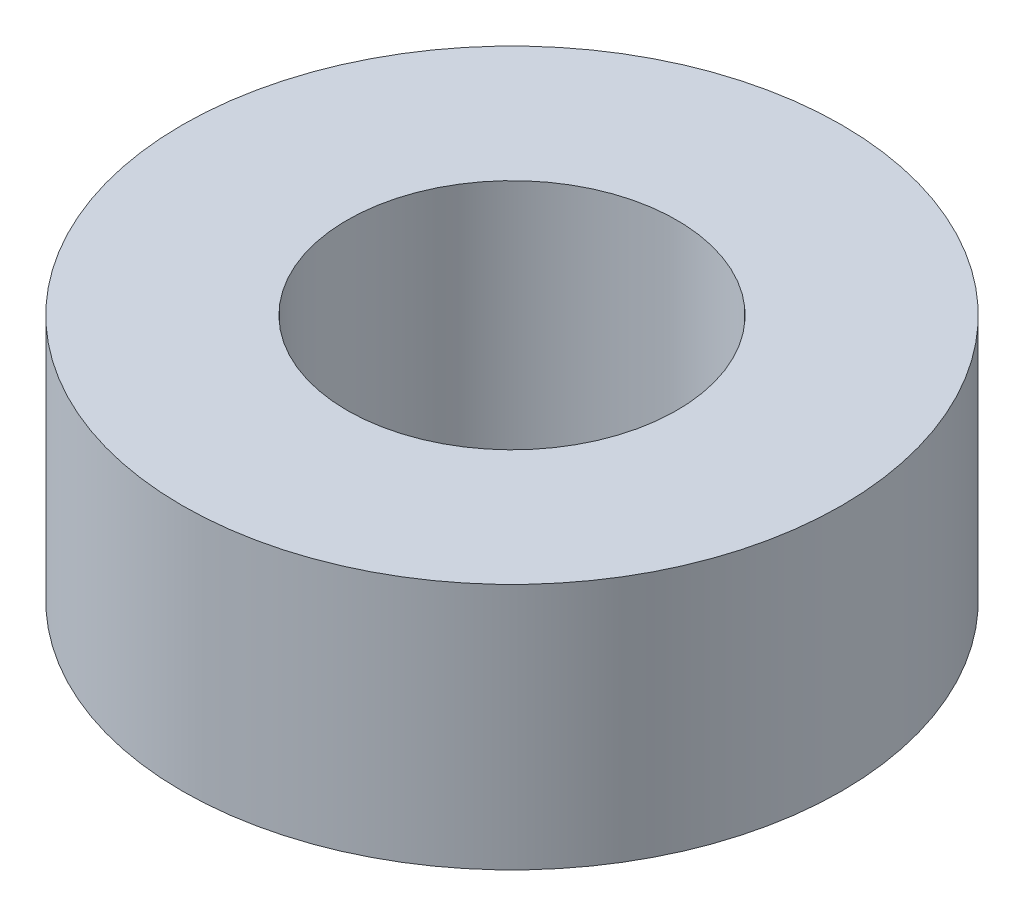
ISO-10303-21;
HEADER;
FILE_DESCRIPTION(('STEP AP214'),'2;1');
FILE_NAME('part.step','',(''),(''),'','','');
FILE_SCHEMA(('AUTOMOTIVE_DESIGN { 1 0 10303 214 1 1 1 1 }'));
ENDSEC;
DATA;
#1=APPLICATION_CONTEXT('core data for automotive mechanical design processes');
#2=APPLICATION_PROTOCOL_DEFINITION('international standard','automotive_design',2000,#1);
#3=PRODUCT_CONTEXT('',#1,'mechanical');
#4=PRODUCT('Part','Part','',(#3));
#5=PRODUCT_RELATED_PRODUCT_CATEGORY('part','',(#4));
#6=PRODUCT_DEFINITION_FORMATION('','',#4);
#7=PRODUCT_DEFINITION_CONTEXT('part definition',#1,'design');
#8=PRODUCT_DEFINITION('design','',#6,#7);
#9=PRODUCT_DEFINITION_SHAPE('','',#8);
#10=(LENGTH_UNIT() NAMED_UNIT(*) SI_UNIT(.MILLI.,.METRE.));
#11=(NAMED_UNIT(*) PLANE_ANGLE_UNIT() SI_UNIT($,.RADIAN.));
#12=(NAMED_UNIT(*) SI_UNIT($,.STERADIAN.) SOLID_ANGLE_UNIT());
#13=UNCERTAINTY_MEASURE_WITH_UNIT(LENGTH_MEASURE(1.E-05),#10,'distance_accuracy_value','');
#14=(GEOMETRIC_REPRESENTATION_CONTEXT(3) GLOBAL_UNCERTAINTY_ASSIGNED_CONTEXT((#13)) GLOBAL_UNIT_ASSIGNED_CONTEXT((#10,
#11,#12)) REPRESENTATION_CONTEXT('',''));
#15=CARTESIAN_POINT('',(0.,0.,0.));
#16=DIRECTION('',(0.,0.,1.));
#17=DIRECTION('',(1.,0.,0.));
#18=AXIS2_PLACEMENT_3D('',#15,#16,#17);
#19=CARTESIAN_POINT('',(0.,4.5,0.));
#20=DIRECTION('',(0.,1.,0.));
#21=DIRECTION('',(0.,0.,1.));
#22=AXIS2_PLACEMENT_3D('',#19,#20,#21);
#23=PLANE('',#22);
#24=CARTESIAN_POINT('',(0.,4.5,0.));
#25=DIRECTION('',(0.,1.,0.));
#26=DIRECTION('',(0.,0.,1.));
#27=AXIS2_PLACEMENT_3D('',#24,#25,#26);
#28=CIRCLE('',#27,6.);
#29=CARTESIAN_POINT('',(0.,4.5,6.));
#30=VERTEX_POINT('',#29);
#31=EDGE_CURVE('E10',#30,#30,#28,.T.);
#32=ORIENTED_EDGE('',*,*,#31,.T.);
#33=EDGE_LOOP('',(#32));
#34=FACE_BOUND('',#33,.T.);
#35=CARTESIAN_POINT('',(0.,4.5,0.));
#36=DIRECTION('',(0.,1.,0.));
#37=DIRECTION('',(0.,0.,1.));
#38=AXIS2_PLACEMENT_3D('',#35,#36,#37);
#39=CIRCLE('',#38,3.);
#40=CARTESIAN_POINT('',(0.,4.5,3.));
#41=VERTEX_POINT('',#40);
#42=EDGE_CURVE('E50',#41,#41,#39,.T.);
#43=ORIENTED_EDGE('',*,*,#42,.F.);
#44=EDGE_LOOP('',(#43));
#45=FACE_BOUND('',#44,.T.);
#46=ADVANCED_FACE('F38',(#34,#45),#23,.T.);
#47=CARTESIAN_POINT('',(0.,0.,0.));
#48=DIRECTION('',(0.,1.,0.));
#49=DIRECTION('',(0.,0.,1.));
#50=AXIS2_PLACEMENT_3D('',#47,#48,#49);
#51=PLANE('',#50);
#52=CARTESIAN_POINT('',(0.,0.,0.));
#53=DIRECTION('',(0.,1.,0.));
#54=DIRECTION('',(0.,0.,1.));
#55=AXIS2_PLACEMENT_3D('',#52,#53,#54);
#56=CIRCLE('',#55,6.);
#57=CARTESIAN_POINT('',(0.,0.,6.));
#58=VERTEX_POINT('',#57);
#59=EDGE_CURVE('E37',#58,#58,#56,.T.);
#60=ORIENTED_EDGE('',*,*,#59,.F.);
#61=EDGE_LOOP('',(#60));
#62=FACE_BOUND('',#61,.T.);
#63=CARTESIAN_POINT('',(0.,0.,0.));
#64=DIRECTION('',(0.,1.,0.));
#65=DIRECTION('',(0.,0.,1.));
#66=AXIS2_PLACEMENT_3D('',#63,#64,#65);
#67=CIRCLE('',#66,3.);
#68=CARTESIAN_POINT('',(0.,0.,3.));
#69=VERTEX_POINT('',#68);
#70=EDGE_CURVE('E47',#69,#69,#67,.T.);
#71=ORIENTED_EDGE('',*,*,#70,.T.);
#72=EDGE_LOOP('',(#71));
#73=FACE_BOUND('',#72,.T.);
#74=ADVANCED_FACE('F56',(#62,#73),#51,.F.);
#75=CARTESIAN_POINT('',(0.,4.5,0.));
#76=DIRECTION('',(0.,-1.,0.));
#77=DIRECTION('',(0.,0.,-1.));
#78=AXIS2_PLACEMENT_3D('',#75,#76,#77);
#79=CYLINDRICAL_SURFACE('',#78,6.);
#80=ORIENTED_EDGE('',*,*,#31,.F.);
#81=EDGE_LOOP('',(#80));
#82=FACE_BOUND('',#81,.T.);
#83=ORIENTED_EDGE('',*,*,#59,.T.);
#84=EDGE_LOOP('',(#83));
#85=FACE_BOUND('',#84,.T.);
#86=ADVANCED_FACE('F36',(#82,#85),#79,.T.);
#87=CARTESIAN_POINT('',(0.,4.5,0.));
#88=DIRECTION('',(0.,-1.,0.));
#89=DIRECTION('',(0.,0.,-1.));
#90=AXIS2_PLACEMENT_3D('',#87,#88,#89);
#91=CYLINDRICAL_SURFACE('',#90,3.);
#92=ORIENTED_EDGE('',*,*,#42,.T.);
#93=EDGE_LOOP('',(#92));
#94=FACE_BOUND('',#93,.T.);
#95=ORIENTED_EDGE('',*,*,#70,.F.);
#96=EDGE_LOOP('',(#95));
#97=FACE_BOUND('',#96,.T.);
#98=ADVANCED_FACE('F54',(#94,#97),#91,.F.);
#99=CLOSED_SHELL('',(#46,#74,#86,#98));
#100=MANIFOLD_SOLID_BREP('B2',#99);
#101=ADVANCED_BREP_SHAPE_REPRESENTATION('',(#18,#100),#14);
#102=SHAPE_DEFINITION_REPRESENTATION(#9,#101);
ENDSEC;
END-ISO-10303-21;
